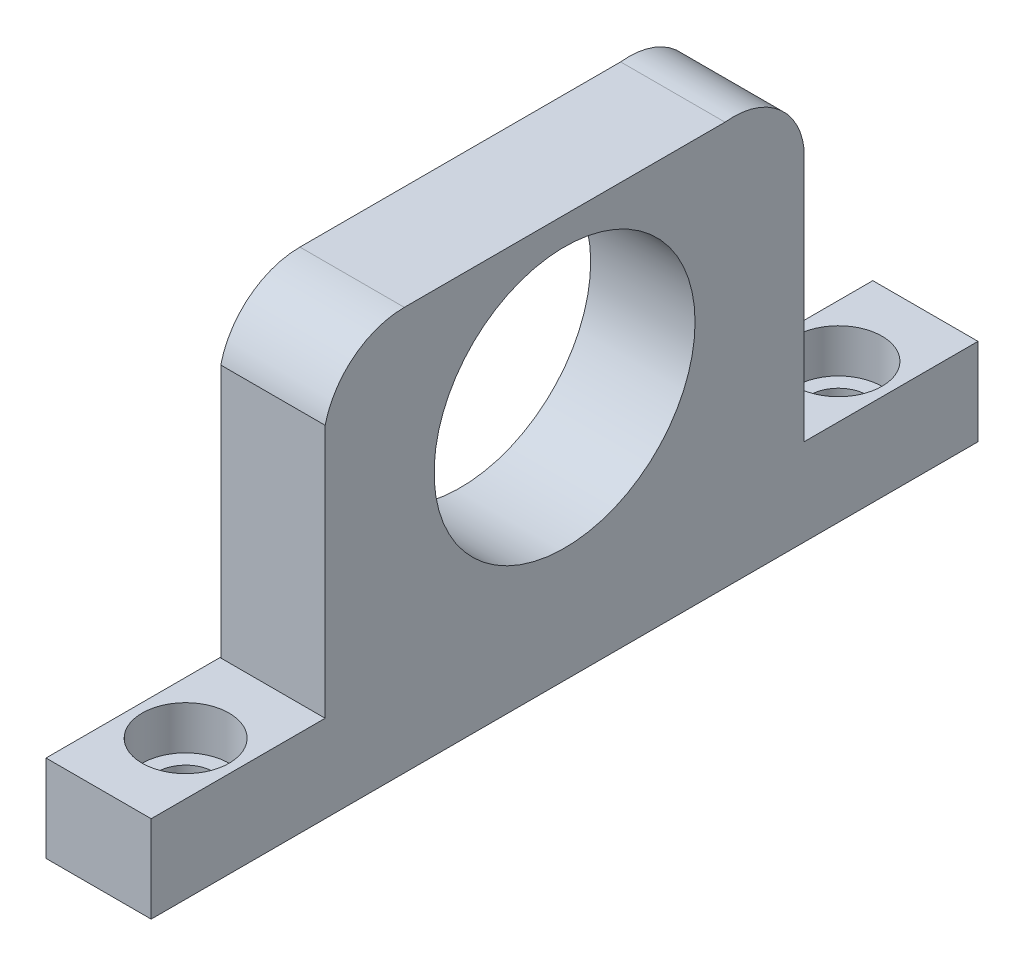
ISO-10303-21;
HEADER;
FILE_DESCRIPTION(('STEP AP214'),'2;1');
FILE_NAME('part.step','',(''),(''),'','','');
FILE_SCHEMA(('AUTOMOTIVE_DESIGN { 1 0 10303 214 1 1 1 1 }'));
ENDSEC;
DATA;
#1=APPLICATION_CONTEXT('core data for automotive mechanical design processes');
#2=APPLICATION_PROTOCOL_DEFINITION('international standard','automotive_design',2000,#1);
#3=PRODUCT_CONTEXT('',#1,'mechanical');
#4=PRODUCT('Part','Part','',(#3));
#5=PRODUCT_RELATED_PRODUCT_CATEGORY('part','',(#4));
#6=PRODUCT_DEFINITION_FORMATION('','',#4);
#7=PRODUCT_DEFINITION_CONTEXT('part definition',#1,'design');
#8=PRODUCT_DEFINITION('design','',#6,#7);
#9=PRODUCT_DEFINITION_SHAPE('','',#8);
#10=(LENGTH_UNIT() NAMED_UNIT(*) SI_UNIT(.MILLI.,.METRE.));
#11=(NAMED_UNIT(*) PLANE_ANGLE_UNIT() SI_UNIT($,.RADIAN.));
#12=(NAMED_UNIT(*) SI_UNIT($,.STERADIAN.) SOLID_ANGLE_UNIT());
#13=UNCERTAINTY_MEASURE_WITH_UNIT(LENGTH_MEASURE(1.E-05),#10,'distance_accuracy_value','');
#14=(GEOMETRIC_REPRESENTATION_CONTEXT(3) GLOBAL_UNCERTAINTY_ASSIGNED_CONTEXT((#13)) GLOBAL_UNIT_ASSIGNED_CONTEXT((#10,
#11,#12)) REPRESENTATION_CONTEXT('',''));
#15=CARTESIAN_POINT('',(0.,0.,0.));
#16=DIRECTION('',(0.,0.,1.));
#17=DIRECTION('',(1.,0.,0.));
#18=AXIS2_PLACEMENT_3D('',#15,#16,#17);
#19=CARTESIAN_POINT('',(0.,2.,0.));
#20=DIRECTION('',(0.,-1.,0.));
#21=DIRECTION('',(0.,0.,-1.));
#22=AXIS2_PLACEMENT_3D('',#19,#20,#21);
#23=PLANE('',#22);
#24=CARTESIAN_POINT('',(-1.2079782872526,2.,-6.82525109869818));
#25=DIRECTION('',(0.,1.,0.));
#26=DIRECTION('',(0.,0.,1.));
#27=AXIS2_PLACEMENT_3D('',#24,#25,#26);
#28=CIRCLE('',#27,1.);
#29=CARTESIAN_POINT('',(-1.2079782872526,2.,-5.82525109869818));
#30=VERTEX_POINT('',#29);
#31=EDGE_CURVE('E172',#30,#30,#28,.T.);
#32=ORIENTED_EDGE('',*,*,#31,.F.);
#33=EDGE_LOOP('',(#32));
#34=FACE_BOUND('',#33,.T.);
#35=CARTESIAN_POINT('',(-1.2079782872526,2.,-21.8352510986982));
#36=DIRECTION('',(0.,1.,0.));
#37=DIRECTION('',(0.,0.,1.));
#38=AXIS2_PLACEMENT_3D('',#35,#36,#37);
#39=CIRCLE('',#38,1.);
#40=CARTESIAN_POINT('',(-1.2079782872526,2.,-20.8352510986982));
#41=VERTEX_POINT('',#40);
#42=EDGE_CURVE('E184',#41,#41,#39,.T.);
#43=ORIENTED_EDGE('',*,*,#42,.F.);
#44=EDGE_LOOP('',(#43));
#45=FACE_BOUND('',#44,.T.);
#46=DIRECTION('',(1.,0.,0.));
#47=VECTOR('',#46,1.);
#48=CARTESIAN_POINT('',(-2.4,2.,-8.82525109869818));
#49=LINE('',#48,#47);
#50=CARTESIAN_POINT('',(-2.4,2.,-8.82525109869818));
#51=VERTEX_POINT('',#50);
#52=CARTESIAN_POINT('',(0.,2.,-8.82525109869818));
#53=VERTEX_POINT('',#52);
#54=EDGE_CURVE('E175',#51,#53,#49,.T.);
#55=ORIENTED_EDGE('',*,*,#54,.F.);
#56=DIRECTION('',(0.,0.,-1.));
#57=VECTOR('',#56,1.);
#58=CARTESIAN_POINT('',(-2.4,2.,-19.8352510986982));
#59=LINE('',#58,#57);
#60=CARTESIAN_POINT('',(-2.4,2.,-19.8352510986982));
#61=VERTEX_POINT('',#60);
#62=EDGE_CURVE('E158',#51,#61,#59,.T.);
#63=ORIENTED_EDGE('',*,*,#62,.T.);
#64=DIRECTION('',(1.,0.,0.));
#65=VECTOR('',#64,1.);
#66=CARTESIAN_POINT('',(-2.4,2.,-19.8352510986982));
#67=LINE('',#66,#65);
#68=CARTESIAN_POINT('',(0.,2.,-19.8352510986982));
#69=VERTEX_POINT('',#68);
#70=EDGE_CURVE('E173',#61,#69,#67,.T.);
#71=ORIENTED_EDGE('',*,*,#70,.T.);
#72=DIRECTION('',(0.,0.,-1.));
#73=VECTOR('',#72,1.);
#74=CARTESIAN_POINT('',(0.,2.,-23.8352510986982));
#75=LINE('',#74,#73);
#76=CARTESIAN_POINT('',(0.,2.,-23.8352510986982));
#77=VERTEX_POINT('',#76);
#78=EDGE_CURVE('E58',#69,#77,#75,.T.);
#79=ORIENTED_EDGE('',*,*,#78,.T.);
#80=DIRECTION('',(-1.,0.,0.));
#81=VECTOR('',#80,1.);
#82=CARTESIAN_POINT('',(-2.4179782872526,2.,-23.8352510986982));
#83=LINE('',#82,#81);
#84=CARTESIAN_POINT('',(-2.4179782872526,2.,-23.8352510986982));
#85=VERTEX_POINT('',#84);
#86=EDGE_CURVE('E199',#77,#85,#83,.T.);
#87=ORIENTED_EDGE('',*,*,#86,.T.);
#88=DIRECTION('',(0.,0.,1.));
#89=VECTOR('',#88,1.);
#90=CARTESIAN_POINT('',(-2.4179782872526,2.,-4.82525109869818));
#91=LINE('',#90,#89);
#92=CARTESIAN_POINT('',(-2.4179782872526,2.,-4.82525109869818));
#93=VERTEX_POINT('',#92);
#94=EDGE_CURVE('E87',#85,#93,#91,.T.);
#95=ORIENTED_EDGE('',*,*,#94,.T.);
#96=DIRECTION('',(1.,0.,0.));
#97=VECTOR('',#96,1.);
#98=CARTESIAN_POINT('',(-2.4179782872526,2.,-4.82525109869818));
#99=LINE('',#98,#97);
#100=CARTESIAN_POINT('',(0.,2.,-4.82525109869818));
#101=VERTEX_POINT('',#100);
#102=EDGE_CURVE('E202',#93,#101,#99,.T.);
#103=ORIENTED_EDGE('',*,*,#102,.T.);
#104=EDGE_CURVE('E204',#101,#53,#75,.T.);
#105=ORIENTED_EDGE('',*,*,#104,.T.);
#106=EDGE_LOOP('',(#55,#63,#71,#79,#87,#95,#103,#105));
#107=FACE_BOUND('',#106,.T.);
#108=ADVANCED_FACE('F33',(#34,#45,#107),#23,.F.);
#109=CARTESIAN_POINT('',(-1.2079782872526,2.,-6.82525109869818));
#110=DIRECTION('',(0.,-1.,0.));
#111=DIRECTION('',(0.,0.,-1.));
#112=AXIS2_PLACEMENT_3D('',#109,#110,#111);
#113=CYLINDRICAL_SURFACE('',#112,0.655);
#114=CARTESIAN_POINT('',(-1.2079782872526,0.,-6.82525109869818));
#115=DIRECTION('',(0.,1.,0.));
#116=DIRECTION('',(0.,0.,1.));
#117=AXIS2_PLACEMENT_3D('',#114,#115,#116);
#118=CIRCLE('',#117,0.655);
#119=CARTESIAN_POINT('',(-1.2079782872526,0.,-6.17025109869818));
#120=VERTEX_POINT('',#119);
#121=EDGE_CURVE('E195',#120,#120,#118,.T.);
#122=ORIENTED_EDGE('',*,*,#121,.F.);
#123=EDGE_LOOP('',(#122));
#124=FACE_BOUND('',#123,.T.);
#125=CARTESIAN_POINT('',(-1.2079782872526,1.,-6.82525109869818));
#126=DIRECTION('',(0.,1.,0.));
#127=DIRECTION('',(0.,0.,1.));
#128=AXIS2_PLACEMENT_3D('',#125,#126,#127);
#129=CIRCLE('',#128,0.655);
#130=CARTESIAN_POINT('',(-1.2079782872526,1.,-6.17025109869818));
#131=VERTEX_POINT('',#130);
#132=EDGE_CURVE('E37',#131,#131,#129,.T.);
#133=ORIENTED_EDGE('',*,*,#132,.T.);
#134=EDGE_LOOP('',(#133));
#135=FACE_BOUND('',#134,.T.);
#136=ADVANCED_FACE('F225',(#124,#135),#113,.F.);
#137=CARTESIAN_POINT('',(-1.2079782872526,2.,-21.8352510986982));
#138=DIRECTION('',(0.,-1.,0.));
#139=DIRECTION('',(0.,0.,-1.));
#140=AXIS2_PLACEMENT_3D('',#137,#138,#139);
#141=CYLINDRICAL_SURFACE('',#140,0.655);
#142=CARTESIAN_POINT('',(-1.2079782872526,0.,-21.8352510986982));
#143=DIRECTION('',(0.,1.,0.));
#144=DIRECTION('',(0.,0.,1.));
#145=AXIS2_PLACEMENT_3D('',#142,#143,#144);
#146=CIRCLE('',#145,0.655);
#147=CARTESIAN_POINT('',(-1.2079782872526,0.,-21.1802510986982));
#148=VERTEX_POINT('',#147);
#149=EDGE_CURVE('E192',#148,#148,#146,.T.);
#150=ORIENTED_EDGE('',*,*,#149,.F.);
#151=EDGE_LOOP('',(#150));
#152=FACE_BOUND('',#151,.T.);
#153=CARTESIAN_POINT('',(-1.2079782872526,1.,-21.8352510986982));
#154=DIRECTION('',(0.,1.,0.));
#155=DIRECTION('',(0.,0.,1.));
#156=AXIS2_PLACEMENT_3D('',#153,#154,#155);
#157=CIRCLE('',#156,0.655);
#158=CARTESIAN_POINT('',(-1.2079782872526,1.,-21.1802510986982));
#159=VERTEX_POINT('',#158);
#160=EDGE_CURVE('E183',#159,#159,#157,.T.);
#161=ORIENTED_EDGE('',*,*,#160,.T.);
#162=EDGE_LOOP('',(#161));
#163=FACE_BOUND('',#162,.T.);
#164=ADVANCED_FACE('F269',(#152,#163),#141,.F.);
#165=CARTESIAN_POINT('',(0.,0.,0.));
#166=DIRECTION('',(0.,-1.,0.));
#167=DIRECTION('',(0.,0.,-1.));
#168=AXIS2_PLACEMENT_3D('',#165,#166,#167);
#169=PLANE('',#168);
#170=ORIENTED_EDGE('',*,*,#121,.T.);
#171=EDGE_LOOP('',(#170));
#172=FACE_BOUND('',#171,.T.);
#173=DIRECTION('',(-1.,0.,0.));
#174=VECTOR('',#173,1.);
#175=CARTESIAN_POINT('',(-2.4179782872526,0.,-23.8352510986982));
#176=LINE('',#175,#174);
#177=CARTESIAN_POINT('',(0.,0.,-23.8352510986982));
#178=VERTEX_POINT('',#177);
#179=CARTESIAN_POINT('',(-2.4179782872526,0.,-23.8352510986982));
#180=VERTEX_POINT('',#179);
#181=EDGE_CURVE('E198',#178,#180,#176,.T.);
#182=ORIENTED_EDGE('',*,*,#181,.F.);
#183=DIRECTION('',(0.,0.,-1.));
#184=VECTOR('',#183,1.);
#185=CARTESIAN_POINT('',(0.,0.,-23.8352510986982));
#186=LINE('',#185,#184);
#187=CARTESIAN_POINT('',(0.,0.,-4.82525109869818));
#188=VERTEX_POINT('',#187);
#189=EDGE_CURVE('E80',#188,#178,#186,.T.);
#190=ORIENTED_EDGE('',*,*,#189,.F.);
#191=DIRECTION('',(1.,0.,0.));
#192=VECTOR('',#191,1.);
#193=CARTESIAN_POINT('',(-2.4179782872526,0.,-4.82525109869818));
#194=LINE('',#193,#192);
#195=CARTESIAN_POINT('',(-2.4179782872526,0.,-4.82525109869818));
#196=VERTEX_POINT('',#195);
#197=EDGE_CURVE('E212',#196,#188,#194,.T.);
#198=ORIENTED_EDGE('',*,*,#197,.F.);
#199=DIRECTION('',(0.,0.,1.));
#200=VECTOR('',#199,1.);
#201=CARTESIAN_POINT('',(-2.4179782872526,0.,-4.82525109869818));
#202=LINE('',#201,#200);
#203=EDGE_CURVE('E210',#180,#196,#202,.T.);
#204=ORIENTED_EDGE('',*,*,#203,.F.);
#205=EDGE_LOOP('',(#182,#190,#198,#204));
#206=FACE_BOUND('',#205,.T.);
#207=ORIENTED_EDGE('',*,*,#149,.T.);
#208=EDGE_LOOP('',(#207));
#209=FACE_BOUND('',#208,.T.);
#210=ADVANCED_FACE('F266',(#172,#206,#209),#169,.T.);
#211=CARTESIAN_POINT('',(-2.4179782872526,2.,-23.8352510986982));
#212=DIRECTION('',(0.,0.,1.));
#213=DIRECTION('',(1.,0.,0.));
#214=AXIS2_PLACEMENT_3D('',#211,#212,#213);
#215=PLANE('',#214);
#216=ORIENTED_EDGE('',*,*,#181,.T.);
#217=DIRECTION('',(0.,-1.,0.));
#218=VECTOR('',#217,1.);
#219=CARTESIAN_POINT('',(-2.4179782872526,2.,-23.8352510986982));
#220=LINE('',#219,#218);
#221=EDGE_CURVE('E11',#85,#180,#220,.T.);
#222=ORIENTED_EDGE('',*,*,#221,.F.);
#223=ORIENTED_EDGE('',*,*,#86,.F.);
#224=DIRECTION('',(0.,-1.,0.));
#225=VECTOR('',#224,1.);
#226=CARTESIAN_POINT('',(0.,2.,-23.8352510986982));
#227=LINE('',#226,#225);
#228=EDGE_CURVE('E207',#77,#178,#227,.T.);
#229=ORIENTED_EDGE('',*,*,#228,.T.);
#230=EDGE_LOOP('',(#216,#222,#223,#229));
#231=FACE_BOUND('',#230,.T.);
#232=ADVANCED_FACE('F35',(#231),#215,.F.);
#233=CARTESIAN_POINT('',(-2.4179782872526,2.,-4.82525109869818));
#234=DIRECTION('',(1.,0.,0.));
#235=DIRECTION('',(0.,0.,-1.));
#236=AXIS2_PLACEMENT_3D('',#233,#234,#235);
#237=PLANE('',#236);
#238=ORIENTED_EDGE('',*,*,#203,.T.);
#239=DIRECTION('',(0.,-1.,0.));
#240=VECTOR('',#239,1.);
#241=CARTESIAN_POINT('',(-2.4179782872526,2.,-4.82525109869818));
#242=LINE('',#241,#240);
#243=EDGE_CURVE('E42',#93,#196,#242,.T.);
#244=ORIENTED_EDGE('',*,*,#243,.F.);
#245=ORIENTED_EDGE('',*,*,#94,.F.);
#246=ORIENTED_EDGE('',*,*,#221,.T.);
#247=EDGE_LOOP('',(#238,#244,#245,#246));
#248=FACE_BOUND('',#247,.T.);
#249=ADVANCED_FACE('F261',(#248),#237,.F.);
#250=CARTESIAN_POINT('',(-2.4179782872526,2.,-4.82525109869818));
#251=DIRECTION('',(0.,0.,-1.));
#252=DIRECTION('',(-1.,0.,0.));
#253=AXIS2_PLACEMENT_3D('',#250,#251,#252);
#254=PLANE('',#253);
#255=ORIENTED_EDGE('',*,*,#197,.T.);
#256=DIRECTION('',(0.,-1.,0.));
#257=VECTOR('',#256,1.);
#258=CARTESIAN_POINT('',(0.,2.,-4.82525109869818));
#259=LINE('',#258,#257);
#260=EDGE_CURVE('E216',#101,#188,#259,.T.);
#261=ORIENTED_EDGE('',*,*,#260,.F.);
#262=ORIENTED_EDGE('',*,*,#102,.F.);
#263=ORIENTED_EDGE('',*,*,#243,.T.);
#264=EDGE_LOOP('',(#255,#261,#262,#263));
#265=FACE_BOUND('',#264,.T.);
#266=ADVANCED_FACE('F264',(#265),#254,.F.);
#267=CARTESIAN_POINT('',(0.,2.,-23.8352510986982));
#268=DIRECTION('',(-1.,0.,0.));
#269=DIRECTION('',(0.,0.,1.));
#270=AXIS2_PLACEMENT_3D('',#267,#268,#269);
#271=PLANE('',#270);
#272=ORIENTED_EDGE('',*,*,#189,.T.);
#273=ORIENTED_EDGE('',*,*,#228,.F.);
#274=ORIENTED_EDGE('',*,*,#78,.F.);
#275=DIRECTION('',(0.,1.,0.));
#276=VECTOR('',#275,1.);
#277=CARTESIAN_POINT('',(0.,2.,-19.8352510986982));
#278=LINE('',#277,#276);
#279=CARTESIAN_POINT('',(0.,7.83348978373818,-19.8352510986982));
#280=VERTEX_POINT('',#279);
#281=EDGE_CURVE('E50',#69,#280,#278,.T.);
#282=ORIENTED_EDGE('',*,*,#281,.T.);
#283=CARTESIAN_POINT('',(0.,7.64920031583789,-18.2114880555473));
#284=DIRECTION('',(1.,0.,0.));
#285=DIRECTION('',(0.,0.,1.));
#286=AXIS2_PLACEMENT_3D('',#283,#284,#285);
#287=CIRCLE('',#286,1.63418757438718);
#288=CARTESIAN_POINT('',(0.,9.27207019704203,-18.0194922822555));
#289=VERTEX_POINT('',#288);
#290=EDGE_CURVE('E162',#280,#289,#287,.T.);
#291=ORIENTED_EDGE('',*,*,#290,.T.);
#292=DIRECTION('',(0.,0.,1.));
#293=VECTOR('',#292,1.);
#294=CARTESIAN_POINT('',(0.,9.27207019704203,-18.0194922822555));
#295=LINE('',#294,#293);
#296=CARTESIAN_POINT('',(0.,9.27207019704203,-10.6452510986982));
#297=VERTEX_POINT('',#296);
#298=EDGE_CURVE('E126',#289,#297,#295,.T.);
#299=ORIENTED_EDGE('',*,*,#298,.T.);
#300=CARTESIAN_POINT('',(0.,7.40150614800797,-10.6452510986982));
#301=DIRECTION('',(1.,0.,0.));
#302=DIRECTION('',(0.,0.,1.));
#303=AXIS2_PLACEMENT_3D('',#300,#301,#302);
#304=CIRCLE('',#303,1.87056404903406);
#305=CARTESIAN_POINT('',(0.,7.83348978373818,-8.82525109869818));
#306=VERTEX_POINT('',#305);
#307=EDGE_CURVE('E166',#297,#306,#304,.T.);
#308=ORIENTED_EDGE('',*,*,#307,.T.);
#309=DIRECTION('',(0.,-1.,0.));
#310=VECTOR('',#309,1.);
#311=CARTESIAN_POINT('',(0.,2.,-8.82525109869818));
#312=LINE('',#311,#310);
#313=EDGE_CURVE('E148',#306,#53,#312,.T.);
#314=ORIENTED_EDGE('',*,*,#313,.T.);
#315=ORIENTED_EDGE('',*,*,#104,.F.);
#316=ORIENTED_EDGE('',*,*,#260,.T.);
#317=EDGE_LOOP('',(#272,#273,#274,#282,#291,#299,#308,#314,#315,#316));
#318=FACE_BOUND('',#317,.T.);
#319=CARTESIAN_POINT('',(0.,5.63603509852102,-14.3302510986982));
#320=DIRECTION('',(1.,0.,0.));
#321=DIRECTION('',(0.,0.,-1.));
#322=AXIS2_PLACEMENT_3D('',#319,#320,#321);
#323=CIRCLE('',#322,3.);
#324=CARTESIAN_POINT('',(0.,5.63603509852102,-17.3302510986982));
#325=VERTEX_POINT('',#324);
#326=EDGE_CURVE('E151',#325,#325,#323,.T.);
#327=ORIENTED_EDGE('',*,*,#326,.F.);
#328=EDGE_LOOP('',(#327));
#329=FACE_BOUND('',#328,.T.);
#330=ADVANCED_FACE('F249',(#318,#329),#271,.F.);
#331=CARTESIAN_POINT('',(-1.2079782872526,1.,-21.8352510986982));
#332=DIRECTION('',(0.,1.,0.));
#333=DIRECTION('',(0.,0.,1.));
#334=AXIS2_PLACEMENT_3D('',#331,#332,#333);
#335=CYLINDRICAL_SURFACE('',#334,1.);
#336=CARTESIAN_POINT('',(-1.2079782872526,1.,-21.8352510986982));
#337=DIRECTION('',(0.,1.,0.));
#338=DIRECTION('',(0.,0.,1.));
#339=AXIS2_PLACEMENT_3D('',#336,#337,#338);
#340=CIRCLE('',#339,1.);
#341=CARTESIAN_POINT('',(-1.2079782872526,1.,-20.8352510986982));
#342=VERTEX_POINT('',#341);
#343=EDGE_CURVE('E180',#342,#342,#340,.T.);
#344=ORIENTED_EDGE('',*,*,#343,.F.);
#345=EDGE_LOOP('',(#344));
#346=FACE_BOUND('',#345,.T.);
#347=ORIENTED_EDGE('',*,*,#42,.T.);
#348=EDGE_LOOP('',(#347));
#349=FACE_BOUND('',#348,.T.);
#350=ADVANCED_FACE('F284',(#346,#349),#335,.F.);
#351=CARTESIAN_POINT('',(-1.2079782872526,1.,-21.8352510986982));
#352=DIRECTION('',(0.,1.,0.));
#353=DIRECTION('',(0.,0.,1.));
#354=AXIS2_PLACEMENT_3D('',#351,#352,#353);
#355=PLANE('',#354);
#356=ORIENTED_EDGE('',*,*,#160,.F.);
#357=EDGE_LOOP('',(#356));
#358=FACE_BOUND('',#357,.T.);
#359=ORIENTED_EDGE('',*,*,#343,.T.);
#360=EDGE_LOOP('',(#359));
#361=FACE_BOUND('',#360,.T.);
#362=ADVANCED_FACE('F236',(#358,#361),#355,.T.);
#363=CARTESIAN_POINT('',(-1.2079782872526,1.,-6.82525109869818));
#364=DIRECTION('',(0.,1.,0.));
#365=DIRECTION('',(0.,0.,1.));
#366=AXIS2_PLACEMENT_3D('',#363,#364,#365);
#367=CYLINDRICAL_SURFACE('',#366,1.);
#368=CARTESIAN_POINT('',(-1.2079782872526,1.,-6.82525109869818));
#369=DIRECTION('',(0.,1.,0.));
#370=DIRECTION('',(0.,0.,1.));
#371=AXIS2_PLACEMENT_3D('',#368,#369,#370);
#372=CIRCLE('',#371,1.);
#373=CARTESIAN_POINT('',(-1.2079782872526,1.,-5.82525109869818));
#374=VERTEX_POINT('',#373);
#375=EDGE_CURVE('E187',#374,#374,#372,.T.);
#376=ORIENTED_EDGE('',*,*,#375,.F.);
#377=EDGE_LOOP('',(#376));
#378=FACE_BOUND('',#377,.T.);
#379=ORIENTED_EDGE('',*,*,#31,.T.);
#380=EDGE_LOOP('',(#379));
#381=FACE_BOUND('',#380,.T.);
#382=ADVANCED_FACE('F230',(#378,#381),#367,.F.);
#383=CARTESIAN_POINT('',(-1.2079782872526,1.,-6.82525109869818));
#384=DIRECTION('',(0.,1.,0.));
#385=DIRECTION('',(0.,0.,1.));
#386=AXIS2_PLACEMENT_3D('',#383,#384,#385);
#387=PLANE('',#386);
#388=ORIENTED_EDGE('',*,*,#132,.F.);
#389=EDGE_LOOP('',(#388));
#390=FACE_BOUND('',#389,.T.);
#391=ORIENTED_EDGE('',*,*,#375,.T.);
#392=EDGE_LOOP('',(#391));
#393=FACE_BOUND('',#392,.T.);
#394=ADVANCED_FACE('F227',(#390,#393),#387,.T.);
#395=CARTESIAN_POINT('',(-2.4,7.64920031583789,-18.2114880555473));
#396=DIRECTION('',(1.,0.,0.));
#397=DIRECTION('',(0.,0.,-1.));
#398=AXIS2_PLACEMENT_3D('',#395,#396,#397);
#399=CYLINDRICAL_SURFACE('',#398,1.63418757438718);
#400=ORIENTED_EDGE('',*,*,#290,.F.);
#401=DIRECTION('',(1.,0.,0.));
#402=VECTOR('',#401,1.);
#403=CARTESIAN_POINT('',(-2.4,7.83348978373818,-19.8352510986982));
#404=LINE('',#403,#402);
#405=CARTESIAN_POINT('',(-2.4,7.83348978373818,-19.8352510986982));
#406=VERTEX_POINT('',#405);
#407=EDGE_CURVE('E146',#406,#280,#404,.T.);
#408=ORIENTED_EDGE('',*,*,#407,.F.);
#409=CARTESIAN_POINT('',(-2.4,7.64920031583789,-18.2114880555473));
#410=DIRECTION('',(1.,0.,0.));
#411=DIRECTION('',(0.,0.,1.));
#412=AXIS2_PLACEMENT_3D('',#409,#410,#411);
#413=CIRCLE('',#412,1.63418757438718);
#414=CARTESIAN_POINT('',(-2.4,9.27207019704203,-18.0194922822555));
#415=VERTEX_POINT('',#414);
#416=EDGE_CURVE('E139',#406,#415,#413,.T.);
#417=ORIENTED_EDGE('',*,*,#416,.T.);
#418=DIRECTION('',(1.,0.,0.));
#419=VECTOR('',#418,1.);
#420=CARTESIAN_POINT('',(-2.4,9.27207019704203,-18.0194922822555));
#421=LINE('',#420,#419);
#422=EDGE_CURVE('E121',#415,#289,#421,.T.);
#423=ORIENTED_EDGE('',*,*,#422,.T.);
#424=EDGE_LOOP('',(#400,#408,#417,#423));
#425=FACE_BOUND('',#424,.T.);
#426=ADVANCED_FACE('F145',(#425),#399,.T.);
#427=CARTESIAN_POINT('',(-2.4,2.,-19.8352510986982));
#428=DIRECTION('',(0.,0.,-1.));
#429=DIRECTION('',(-1.,0.,0.));
#430=AXIS2_PLACEMENT_3D('',#427,#428,#429);
#431=PLANE('',#430);
#432=ORIENTED_EDGE('',*,*,#281,.F.);
#433=ORIENTED_EDGE('',*,*,#70,.F.);
#434=DIRECTION('',(0.,1.,0.));
#435=VECTOR('',#434,1.);
#436=CARTESIAN_POINT('',(-2.4,2.,-19.8352510986982));
#437=LINE('',#436,#435);
#438=EDGE_CURVE('E132',#61,#406,#437,.T.);
#439=ORIENTED_EDGE('',*,*,#438,.T.);
#440=ORIENTED_EDGE('',*,*,#407,.T.);
#441=EDGE_LOOP('',(#432,#433,#439,#440));
#442=FACE_BOUND('',#441,.T.);
#443=ADVANCED_FACE('F254',(#442),#431,.T.);
#444=CARTESIAN_POINT('',(-2.4,2.,-8.82525109869818));
#445=DIRECTION('',(0.,0.,1.));
#446=DIRECTION('',(1.,0.,0.));
#447=AXIS2_PLACEMENT_3D('',#444,#445,#446);
#448=PLANE('',#447);
#449=ORIENTED_EDGE('',*,*,#313,.F.);
#450=DIRECTION('',(1.,0.,0.));
#451=VECTOR('',#450,1.);
#452=CARTESIAN_POINT('',(-2.4,7.83348978373818,-8.82525109869818));
#453=LINE('',#452,#451);
#454=CARTESIAN_POINT('',(-2.4,7.83348978373818,-8.82525109869818));
#455=VERTEX_POINT('',#454);
#456=EDGE_CURVE('E177',#455,#306,#453,.T.);
#457=ORIENTED_EDGE('',*,*,#456,.F.);
#458=DIRECTION('',(0.,-1.,0.));
#459=VECTOR('',#458,1.);
#460=CARTESIAN_POINT('',(-2.4,2.,-8.82525109869818));
#461=LINE('',#460,#459);
#462=EDGE_CURVE('E155',#455,#51,#461,.T.);
#463=ORIENTED_EDGE('',*,*,#462,.T.);
#464=ORIENTED_EDGE('',*,*,#54,.T.);
#465=EDGE_LOOP('',(#449,#457,#463,#464));
#466=FACE_BOUND('',#465,.T.);
#467=ADVANCED_FACE('F248',(#466),#448,.T.);
#468=CARTESIAN_POINT('',(-2.4,7.40150614800797,-10.6452510986982));
#469=DIRECTION('',(1.,0.,0.));
#470=DIRECTION('',(0.,0.,-1.));
#471=AXIS2_PLACEMENT_3D('',#468,#469,#470);
#472=CYLINDRICAL_SURFACE('',#471,1.87056404903406);
#473=ORIENTED_EDGE('',*,*,#307,.F.);
#474=DIRECTION('',(1.,0.,0.));
#475=VECTOR('',#474,1.);
#476=CARTESIAN_POINT('',(-2.4,9.27207019704203,-10.6452510986982));
#477=LINE('',#476,#475);
#478=CARTESIAN_POINT('',(-2.4,9.27207019704203,-10.6452510986982));
#479=VERTEX_POINT('',#478);
#480=EDGE_CURVE('E131',#479,#297,#477,.T.);
#481=ORIENTED_EDGE('',*,*,#480,.F.);
#482=CARTESIAN_POINT('',(-2.4,7.40150614800797,-10.6452510986982));
#483=DIRECTION('',(1.,0.,0.));
#484=DIRECTION('',(0.,0.,1.));
#485=AXIS2_PLACEMENT_3D('',#482,#483,#484);
#486=CIRCLE('',#485,1.87056404903406);
#487=EDGE_CURVE('E143',#479,#455,#486,.T.);
#488=ORIENTED_EDGE('',*,*,#487,.T.);
#489=ORIENTED_EDGE('',*,*,#456,.T.);
#490=EDGE_LOOP('',(#473,#481,#488,#489));
#491=FACE_BOUND('',#490,.T.);
#492=ADVANCED_FACE('F253',(#491),#472,.T.);
#493=CARTESIAN_POINT('',(-2.4,9.27207019704203,-18.0194922822555));
#494=DIRECTION('',(0.,1.,0.));
#495=DIRECTION('',(0.,0.,1.));
#496=AXIS2_PLACEMENT_3D('',#493,#494,#495);
#497=PLANE('',#496);
#498=ORIENTED_EDGE('',*,*,#298,.F.);
#499=ORIENTED_EDGE('',*,*,#422,.F.);
#500=DIRECTION('',(0.,0.,1.));
#501=VECTOR('',#500,1.);
#502=CARTESIAN_POINT('',(-2.4,9.27207019704203,-18.0194922822555));
#503=LINE('',#502,#501);
#504=EDGE_CURVE('E124',#415,#479,#503,.T.);
#505=ORIENTED_EDGE('',*,*,#504,.T.);
#506=ORIENTED_EDGE('',*,*,#480,.T.);
#507=EDGE_LOOP('',(#498,#499,#505,#506));
#508=FACE_BOUND('',#507,.T.);
#509=ADVANCED_FACE('F123',(#508),#497,.T.);
#510=CARTESIAN_POINT('',(-2.4,7.64920031583789,-18.2114880555473));
#511=DIRECTION('',(-1.,0.,0.));
#512=DIRECTION('',(0.,0.,1.));
#513=AXIS2_PLACEMENT_3D('',#510,#511,#512);
#514=PLANE('',#513);
#515=CARTESIAN_POINT('',(-2.4,5.63603509852102,-14.3302510986982));
#516=DIRECTION('',(1.,0.,0.));
#517=DIRECTION('',(0.,0.,-1.));
#518=AXIS2_PLACEMENT_3D('',#515,#516,#517);
#519=CIRCLE('',#518,3.);
#520=CARTESIAN_POINT('',(-2.4,5.63603509852102,-17.3302510986982));
#521=VERTEX_POINT('',#520);
#522=EDGE_CURVE('E164',#521,#521,#519,.T.);
#523=ORIENTED_EDGE('',*,*,#522,.T.);
#524=EDGE_LOOP('',(#523));
#525=FACE_BOUND('',#524,.T.);
#526=ORIENTED_EDGE('',*,*,#416,.F.);
#527=ORIENTED_EDGE('',*,*,#438,.F.);
#528=ORIENTED_EDGE('',*,*,#62,.F.);
#529=ORIENTED_EDGE('',*,*,#462,.F.);
#530=ORIENTED_EDGE('',*,*,#487,.F.);
#531=ORIENTED_EDGE('',*,*,#504,.F.);
#532=EDGE_LOOP('',(#526,#527,#528,#529,#530,#531));
#533=FACE_BOUND('',#532,.T.);
#534=ADVANCED_FACE('F137',(#525,#533),#514,.T.);
#535=CARTESIAN_POINT('',(-2.4,5.63603509852102,-14.3302510986982));
#536=DIRECTION('',(1.,0.,0.));
#537=DIRECTION('',(0.,0.,-1.));
#538=AXIS2_PLACEMENT_3D('',#535,#536,#537);
#539=CYLINDRICAL_SURFACE('',#538,3.);
#540=ORIENTED_EDGE('',*,*,#522,.F.);
#541=EDGE_LOOP('',(#540));
#542=FACE_BOUND('',#541,.T.);
#543=ORIENTED_EDGE('',*,*,#326,.T.);
#544=EDGE_LOOP('',(#543));
#545=FACE_BOUND('',#544,.T.);
#546=ADVANCED_FACE('F406',(#542,#545),#539,.F.);
#547=CLOSED_SHELL('',(#108,#136,#164,#210,#232,#249,#266,#330,#350,#362,#382,#394,#426,#443,
#467,#492,#509,#534,#546));
#548=MANIFOLD_SOLID_BREP('B2',#547);
#549=ADVANCED_BREP_SHAPE_REPRESENTATION('',(#18,#548),#14);
#550=SHAPE_DEFINITION_REPRESENTATION(#9,#549);
ENDSEC;
END-ISO-10303-21;
